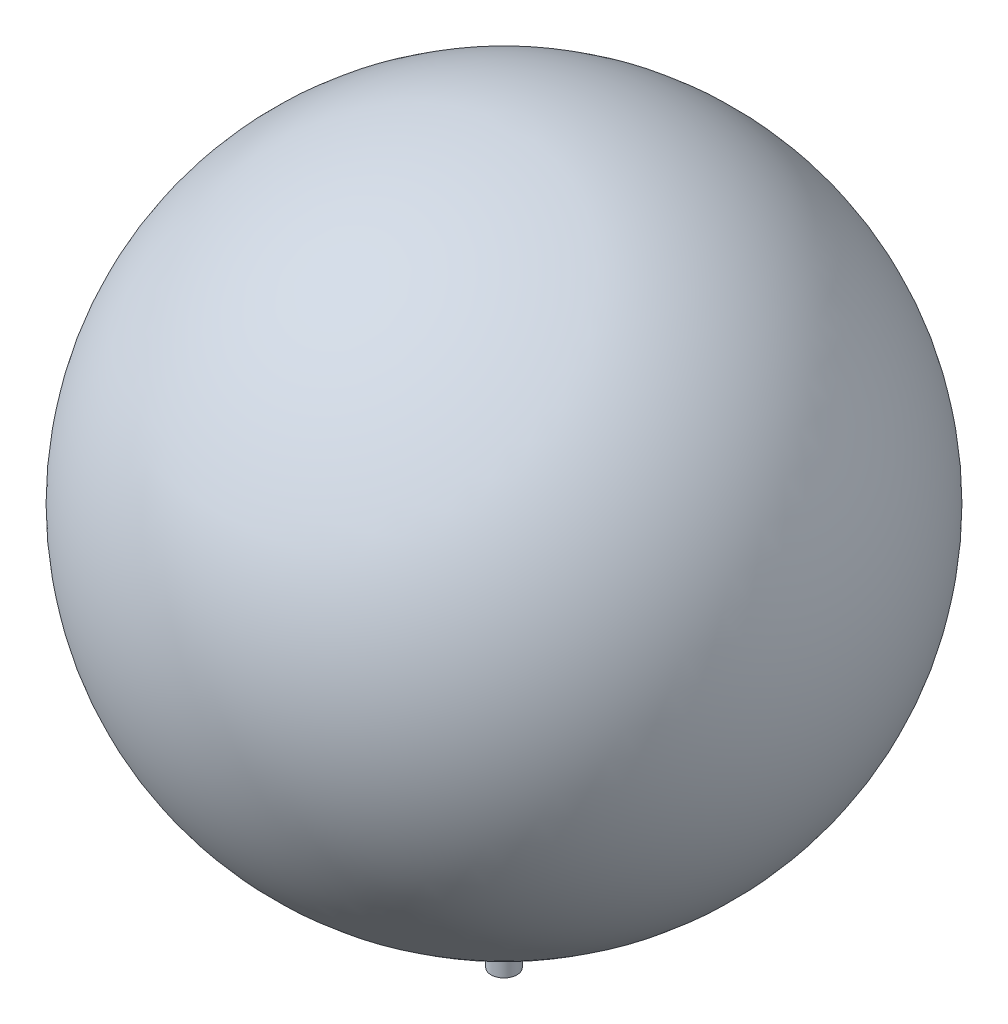
ISO-10303-21;
HEADER;
FILE_DESCRIPTION(('STEP AP214'),'2;1');
FILE_NAME('part.step','',(''),(''),'','','');
FILE_SCHEMA(('AUTOMOTIVE_DESIGN { 1 0 10303 214 1 1 1 1 }'));
ENDSEC;
DATA;
#1=APPLICATION_CONTEXT('core data for automotive mechanical design processes');
#2=APPLICATION_PROTOCOL_DEFINITION('international standard','automotive_design',2000,#1);
#3=PRODUCT_CONTEXT('',#1,'mechanical');
#4=PRODUCT('Part','Part','',(#3));
#5=PRODUCT_RELATED_PRODUCT_CATEGORY('part','',(#4));
#6=PRODUCT_DEFINITION_FORMATION('','',#4);
#7=PRODUCT_DEFINITION_CONTEXT('part definition',#1,'design');
#8=PRODUCT_DEFINITION('design','',#6,#7);
#9=PRODUCT_DEFINITION_SHAPE('','',#8);
#10=(LENGTH_UNIT() NAMED_UNIT(*) SI_UNIT(.MILLI.,.METRE.));
#11=(NAMED_UNIT(*) PLANE_ANGLE_UNIT() SI_UNIT($,.RADIAN.));
#12=(NAMED_UNIT(*) SI_UNIT($,.STERADIAN.) SOLID_ANGLE_UNIT());
#13=UNCERTAINTY_MEASURE_WITH_UNIT(LENGTH_MEASURE(1.E-05),#10,'distance_accuracy_value','');
#14=(GEOMETRIC_REPRESENTATION_CONTEXT(3) GLOBAL_UNCERTAINTY_ASSIGNED_CONTEXT((#13)) GLOBAL_UNIT_ASSIGNED_CONTEXT((#10,
#11,#12)) REPRESENTATION_CONTEXT('',''));
#15=CARTESIAN_POINT('',(0.,0.,0.));
#16=DIRECTION('',(0.,0.,1.));
#17=DIRECTION('',(1.,0.,0.));
#18=AXIS2_PLACEMENT_3D('',#15,#16,#17);
#19=CARTESIAN_POINT('',(0.,-6.,0.));
#20=DIRECTION('',(0.,1.,0.));
#21=DIRECTION('',(0.,0.,1.));
#22=AXIS2_PLACEMENT_3D('',#19,#20,#21);
#23=CYLINDRICAL_SURFACE('',#22,1.);
#24=CARTESIAN_POINT('',(0.,-6.,0.));
#25=DIRECTION('',(0.,1.,0.));
#26=DIRECTION('',(0.,0.,1.));
#27=AXIS2_PLACEMENT_3D('',#24,#25,#26);
#28=CIRCLE('',#27,1.);
#29=CARTESIAN_POINT('',(0.,-6.,1.));
#30=VERTEX_POINT('',#29);
#31=EDGE_CURVE('E11',#30,#30,#28,.T.);
#32=ORIENTED_EDGE('',*,*,#31,.T.);
#33=EDGE_LOOP('',(#32));
#34=FACE_BOUND('',#33,.T.);
#35=CARTESIAN_POINT('',(0.,0.,0.));
#36=DIRECTION('',(0.,1.,0.));
#37=DIRECTION('',(0.,0.,1.));
#38=AXIS2_PLACEMENT_3D('',#35,#36,#37);
#39=CIRCLE('',#38,1.);
#40=CARTESIAN_POINT('',(0.,0.,1.));
#41=VERTEX_POINT('',#40);
#42=EDGE_CURVE('E40',#41,#41,#39,.T.);
#43=ORIENTED_EDGE('',*,*,#42,.F.);
#44=EDGE_LOOP('',(#43));
#45=FACE_BOUND('',#44,.T.);
#46=ADVANCED_FACE('F37',(#34,#45),#23,.T.);
#47=CARTESIAN_POINT('',(0.,-6.,0.));
#48=DIRECTION('',(0.,1.,0.));
#49=DIRECTION('',(0.,0.,1.));
#50=AXIS2_PLACEMENT_3D('',#47,#48,#49);
#51=PLANE('',#50);
#52=ORIENTED_EDGE('',*,*,#31,.F.);
#53=EDGE_LOOP('',(#52));
#54=FACE_BOUND('',#53,.T.);
#55=ADVANCED_FACE('F52',(#54),#51,.F.);
#56=CARTESIAN_POINT('',(0.,0.,0.));
#57=DIRECTION('',(0.,1.,0.));
#58=DIRECTION('',(0.,0.,1.));
#59=AXIS2_PLACEMENT_3D('',#56,#57,#58);
#60=PLANE('',#59);
#61=ORIENTED_EDGE('',*,*,#42,.T.);
#62=EDGE_LOOP('',(#61));
#63=FACE_BOUND('',#62,.T.);
#64=ADVANCED_FACE('F49',(#63),#60,.T.);
#65=CLOSED_SHELL('',(#46,#55,#64));
#66=MANIFOLD_SOLID_BREP('B2',#65);
#67=CARTESIAN_POINT('',(0.,25.,0.));
#68=DIRECTION('',(0.,-1.,0.));
#69=DIRECTION('',(-1.,0.,0.));
#70=AXIS2_PLACEMENT_3D('',#67,#68,#69);
#71=SPHERICAL_SURFACE('',#70,25.);
#72=CARTESIAN_POINT('',(0.,0.,0.));
#73=VERTEX_POINT('',#72);
#74=VERTEX_LOOP('',#73);
#75=FACE_BOUND('',#74,.T.);
#76=ADVANCED_FACE('F78',(#75),#71,.T.);
#77=CLOSED_SHELL('',(#76));
#78=MANIFOLD_SOLID_BREP('B6',#77);
#79=ADVANCED_BREP_SHAPE_REPRESENTATION('',(#18,#66,#78),#14);
#80=SHAPE_DEFINITION_REPRESENTATION(#9,#79);
ENDSEC;
END-ISO-10303-21;
